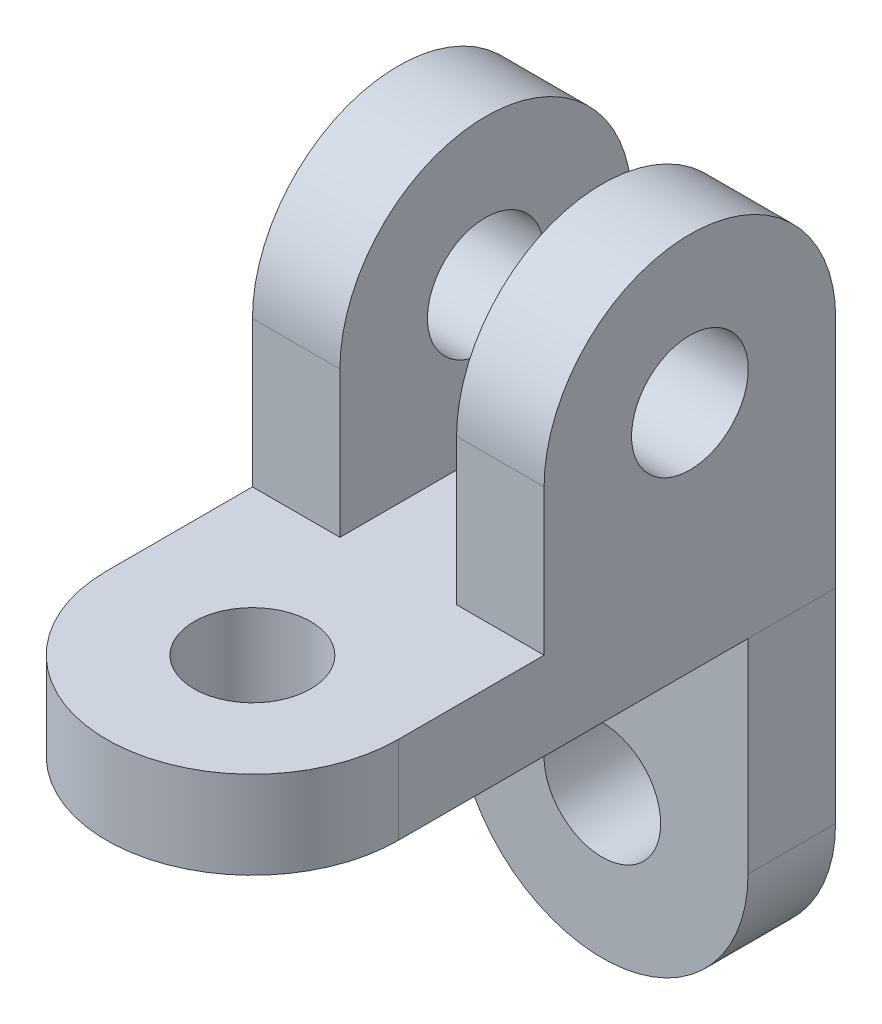
ISO-10303-21;
HEADER;
FILE_DESCRIPTION(('STEP AP214'),'2;1');
FILE_NAME('part.step','',(''),(''),'','','');
FILE_SCHEMA(('AUTOMOTIVE_DESIGN { 1 0 10303 214 1 1 1 1 }'));
ENDSEC;
DATA;
#1=APPLICATION_CONTEXT('core data for automotive mechanical design processes');
#2=APPLICATION_PROTOCOL_DEFINITION('international standard','automotive_design',2000,#1);
#3=PRODUCT_CONTEXT('',#1,'mechanical');
#4=PRODUCT('Part','Part','',(#3));
#5=PRODUCT_RELATED_PRODUCT_CATEGORY('part','',(#4));
#6=PRODUCT_DEFINITION_FORMATION('','',#4);
#7=PRODUCT_DEFINITION_CONTEXT('part definition',#1,'design');
#8=PRODUCT_DEFINITION('design','',#6,#7);
#9=PRODUCT_DEFINITION_SHAPE('','',#8);
#10=(LENGTH_UNIT() NAMED_UNIT(*) SI_UNIT(.MILLI.,.METRE.));
#11=(NAMED_UNIT(*) PLANE_ANGLE_UNIT() SI_UNIT($,.RADIAN.));
#12=(NAMED_UNIT(*) SI_UNIT($,.STERADIAN.) SOLID_ANGLE_UNIT());
#13=UNCERTAINTY_MEASURE_WITH_UNIT(LENGTH_MEASURE(1.E-05),#10,'distance_accuracy_value','');
#14=(GEOMETRIC_REPRESENTATION_CONTEXT(3) GLOBAL_UNCERTAINTY_ASSIGNED_CONTEXT((#13)) GLOBAL_UNIT_ASSIGNED_CONTEXT((#10,
#11,#12)) REPRESENTATION_CONTEXT('',''));
#15=CARTESIAN_POINT('',(0.,0.,0.));
#16=DIRECTION('',(0.,0.,1.));
#17=DIRECTION('',(1.,0.,0.));
#18=AXIS2_PLACEMENT_3D('',#15,#16,#17);
#19=CARTESIAN_POINT('',(0.,0.,0.));
#20=DIRECTION('',(0.,1.,0.));
#21=DIRECTION('',(0.,0.,1.));
#22=AXIS2_PLACEMENT_3D('',#19,#20,#21);
#23=PLANE('',#22);
#24=CARTESIAN_POINT('',(0.,0.,60.));
#25=DIRECTION('',(0.,1.,0.));
#26=DIRECTION('',(0.,0.,1.));
#27=AXIS2_PLACEMENT_3D('',#24,#25,#26);
#28=CIRCLE('',#27,8.);
#29=CARTESIAN_POINT('',(0.,0.,68.));
#30=VERTEX_POINT('',#29);
#31=EDGE_CURVE('E258',#30,#30,#28,.T.);
#32=ORIENTED_EDGE('',*,*,#31,.T.);
#33=EDGE_LOOP('',(#32));
#34=FACE_BOUND('',#33,.T.);
#35=DIRECTION('',(-1.,0.,0.));
#36=VECTOR('',#35,1.);
#37=CARTESIAN_POINT('',(0.,0.,12.));
#38=LINE('',#37,#36);
#39=CARTESIAN_POINT('',(20.,0.,12.));
#40=VERTEX_POINT('',#39);
#41=CARTESIAN_POINT('',(-20.,0.,12.));
#42=VERTEX_POINT('',#41);
#43=EDGE_CURVE('E61',#40,#42,#38,.T.);
#44=ORIENTED_EDGE('',*,*,#43,.F.);
#45=DIRECTION('',(0.,0.,-1.));
#46=VECTOR('',#45,1.);
#47=CARTESIAN_POINT('',(20.,0.,0.));
#48=LINE('',#47,#46);
#49=CARTESIAN_POINT('',(20.,0.,60.));
#50=VERTEX_POINT('',#49);
#51=EDGE_CURVE('E276',#50,#40,#48,.T.);
#52=ORIENTED_EDGE('',*,*,#51,.F.);
#53=CARTESIAN_POINT('',(0.,0.,60.));
#54=DIRECTION('',(0.,1.,0.));
#55=DIRECTION('',(0.,0.,1.));
#56=AXIS2_PLACEMENT_3D('',#53,#54,#55);
#57=CIRCLE('',#56,20.);
#58=CARTESIAN_POINT('',(-20.,0.,60.));
#59=VERTEX_POINT('',#58);
#60=EDGE_CURVE('E252',#59,#50,#57,.T.);
#61=ORIENTED_EDGE('',*,*,#60,.F.);
#62=DIRECTION('',(0.,0.,1.));
#63=VECTOR('',#62,1.);
#64=CARTESIAN_POINT('',(-20.,0.,0.));
#65=LINE('',#64,#63);
#66=EDGE_CURVE('E279',#42,#59,#65,.T.);
#67=ORIENTED_EDGE('',*,*,#66,.F.);
#68=EDGE_LOOP('',(#44,#52,#61,#67));
#69=FACE_BOUND('',#68,.T.);
#70=ADVANCED_FACE('F45',(#34,#69),#23,.F.);
#71=CARTESIAN_POINT('',(0.,12.,60.));
#72=DIRECTION('',(0.,-1.,0.));
#73=DIRECTION('',(0.,0.,-1.));
#74=AXIS2_PLACEMENT_3D('',#71,#72,#73);
#75=CYLINDRICAL_SURFACE('',#74,20.);
#76=ORIENTED_EDGE('',*,*,#60,.T.);
#77=DIRECTION('',(0.,-1.,0.));
#78=VECTOR('',#77,1.);
#79=CARTESIAN_POINT('',(20.,12.,60.));
#80=LINE('',#79,#78);
#81=CARTESIAN_POINT('',(20.,12.,60.));
#82=VERTEX_POINT('',#81);
#83=EDGE_CURVE('E11',#82,#50,#80,.T.);
#84=ORIENTED_EDGE('',*,*,#83,.F.);
#85=CARTESIAN_POINT('',(0.,12.,60.));
#86=DIRECTION('',(0.,1.,0.));
#87=DIRECTION('',(0.,0.,1.));
#88=AXIS2_PLACEMENT_3D('',#85,#86,#87);
#89=CIRCLE('',#88,20.);
#90=CARTESIAN_POINT('',(-20.,12.,60.));
#91=VERTEX_POINT('',#90);
#92=EDGE_CURVE('E253',#91,#82,#89,.T.);
#93=ORIENTED_EDGE('',*,*,#92,.F.);
#94=DIRECTION('',(0.,-1.,0.));
#95=VECTOR('',#94,1.);
#96=CARTESIAN_POINT('',(-20.,12.,60.));
#97=LINE('',#96,#95);
#98=EDGE_CURVE('E272',#91,#59,#97,.T.);
#99=ORIENTED_EDGE('',*,*,#98,.T.);
#100=EDGE_LOOP('',(#76,#84,#93,#99));
#101=FACE_BOUND('',#100,.T.);
#102=ADVANCED_FACE('F47',(#101),#75,.T.);
#103=CARTESIAN_POINT('',(20.,12.,0.));
#104=DIRECTION('',(-1.,0.,0.));
#105=DIRECTION('',(0.,0.,1.));
#106=AXIS2_PLACEMENT_3D('',#103,#104,#105);
#107=PLANE('',#106);
#108=ORIENTED_EDGE('',*,*,#51,.T.);
#109=DIRECTION('',(0.,0.,-1.));
#110=VECTOR('',#109,1.);
#111=CARTESIAN_POINT('',(20.,0.,12.));
#112=LINE('',#111,#110);
#113=CARTESIAN_POINT('',(20.,0.,0.));
#114=VERTEX_POINT('',#113);
#115=EDGE_CURVE('E146',#40,#114,#112,.T.);
#116=ORIENTED_EDGE('',*,*,#115,.T.);
#117=DIRECTION('',(0.,-1.,0.));
#118=VECTOR('',#117,1.);
#119=CARTESIAN_POINT('',(20.,12.,0.));
#120=LINE('',#119,#118);
#121=CARTESIAN_POINT('',(20.,32.,0.));
#122=VERTEX_POINT('',#121);
#123=EDGE_CURVE('E54',#122,#114,#120,.T.);
#124=ORIENTED_EDGE('',*,*,#123,.F.);
#125=CARTESIAN_POINT('',(20.,32.,20.));
#126=DIRECTION('',(1.,0.,0.));
#127=DIRECTION('',(0.,0.,-1.));
#128=AXIS2_PLACEMENT_3D('',#125,#126,#127);
#129=CIRCLE('',#128,20.);
#130=CARTESIAN_POINT('',(20.,32.,40.));
#131=VERTEX_POINT('',#130);
#132=EDGE_CURVE('E212',#122,#131,#129,.T.);
#133=ORIENTED_EDGE('',*,*,#132,.T.);
#134=DIRECTION('',(0.,-1.,0.));
#135=VECTOR('',#134,1.);
#136=CARTESIAN_POINT('',(20.,0.,40.));
#137=LINE('',#136,#135);
#138=CARTESIAN_POINT('',(20.,12.,40.));
#139=VERTEX_POINT('',#138);
#140=EDGE_CURVE('E216',#131,#139,#137,.T.);
#141=ORIENTED_EDGE('',*,*,#140,.T.);
#142=DIRECTION('',(0.,0.,-1.));
#143=VECTOR('',#142,1.);
#144=CARTESIAN_POINT('',(20.,12.,0.));
#145=LINE('',#144,#143);
#146=EDGE_CURVE('E257',#82,#139,#145,.T.);
#147=ORIENTED_EDGE('',*,*,#146,.F.);
#148=ORIENTED_EDGE('',*,*,#83,.T.);
#149=EDGE_LOOP('',(#108,#116,#124,#133,#141,#147,#148));
#150=FACE_BOUND('',#149,.T.);
#151=CARTESIAN_POINT('',(20.,32.,20.));
#152=DIRECTION('',(1.,0.,0.));
#153=DIRECTION('',(0.,0.,-1.));
#154=AXIS2_PLACEMENT_3D('',#151,#152,#153);
#155=CIRCLE('',#154,8.);
#156=CARTESIAN_POINT('',(20.,32.,12.));
#157=VERTEX_POINT('',#156);
#158=EDGE_CURVE('E220',#157,#157,#155,.T.);
#159=ORIENTED_EDGE('',*,*,#158,.F.);
#160=EDGE_LOOP('',(#159));
#161=FACE_BOUND('',#160,.T.);
#162=ADVANCED_FACE('F345',(#150,#161),#107,.F.);
#163=CARTESIAN_POINT('',(0.,12.,0.));
#164=DIRECTION('',(0.,0.,1.));
#165=DIRECTION('',(1.,0.,0.));
#166=AXIS2_PLACEMENT_3D('',#163,#164,#165);
#167=PLANE('',#166);
#168=ORIENTED_EDGE('',*,*,#123,.T.);
#169=DIRECTION('',(0.000995136954252468,0.999999504851099,0.));
#170=VECTOR('',#169,1.);
#171=CARTESIAN_POINT('',(19.9999801940488,-0.01990272923023,0.));
#172=LINE('',#171,#170);
#173=CARTESIAN_POINT('',(19.9721361514842,-28.,0.));
#174=VERTEX_POINT('',#173);
#175=EDGE_CURVE('E296',#174,#114,#172,.T.);
#176=ORIENTED_EDGE('',*,*,#175,.F.);
#177=CARTESIAN_POINT('',(-0.0139319242578925,-28.,0.));
#178=DIRECTION('',(0.,0.,1.));
#179=DIRECTION('',(1.,0.,0.));
#180=AXIS2_PLACEMENT_3D('',#177,#178,#179);
#181=CIRCLE('',#180,19.9860680757421);
#182=CARTESIAN_POINT('',(-20.,-28.,0.));
#183=VERTEX_POINT('',#182);
#184=EDGE_CURVE('E164',#183,#174,#181,.T.);
#185=ORIENTED_EDGE('',*,*,#184,.F.);
#186=DIRECTION('',(0.,-1.,0.));
#187=VECTOR('',#186,1.);
#188=CARTESIAN_POINT('',(-20.,12.,0.));
#189=LINE('',#188,#187);
#190=CARTESIAN_POINT('',(-20.,32.,0.));
#191=VERTEX_POINT('',#190);
#192=EDGE_CURVE('E288',#191,#183,#189,.T.);
#193=ORIENTED_EDGE('',*,*,#192,.F.);
#194=DIRECTION('',(1.,0.,0.));
#195=VECTOR('',#194,1.);
#196=CARTESIAN_POINT('',(-20.,32.,0.));
#197=LINE('',#196,#195);
#198=CARTESIAN_POINT('',(-8.,32.,0.));
#199=VERTEX_POINT('',#198);
#200=EDGE_CURVE('E188',#191,#199,#197,.T.);
#201=ORIENTED_EDGE('',*,*,#200,.T.);
#202=DIRECTION('',(0.,1.,0.));
#203=VECTOR('',#202,1.);
#204=CARTESIAN_POINT('',(-8.,0.,0.));
#205=LINE('',#204,#203);
#206=CARTESIAN_POINT('',(-8.,12.,0.));
#207=VERTEX_POINT('',#206);
#208=EDGE_CURVE('E171',#207,#199,#205,.T.);
#209=ORIENTED_EDGE('',*,*,#208,.F.);
#210=DIRECTION('',(-1.,0.,0.));
#211=VECTOR('',#210,1.);
#212=CARTESIAN_POINT('',(0.,12.,0.));
#213=LINE('',#212,#211);
#214=CARTESIAN_POINT('',(8.,12.,0.));
#215=VERTEX_POINT('',#214);
#216=EDGE_CURVE('E262',#215,#207,#213,.T.);
#217=ORIENTED_EDGE('',*,*,#216,.F.);
#218=DIRECTION('',(0.,1.,0.));
#219=VECTOR('',#218,1.);
#220=CARTESIAN_POINT('',(8.,0.,0.));
#221=LINE('',#220,#219);
#222=CARTESIAN_POINT('',(8.,32.,0.));
#223=VERTEX_POINT('',#222);
#224=EDGE_CURVE('E235',#215,#223,#221,.T.);
#225=ORIENTED_EDGE('',*,*,#224,.T.);
#226=DIRECTION('',(-1.,0.,0.));
#227=VECTOR('',#226,1.);
#228=CARTESIAN_POINT('',(20.,32.,0.));
#229=LINE('',#228,#227);
#230=EDGE_CURVE('E224',#122,#223,#229,.T.);
#231=ORIENTED_EDGE('',*,*,#230,.F.);
#232=EDGE_LOOP('',(#168,#176,#185,#193,#201,#209,#217,#225,#231));
#233=FACE_BOUND('',#232,.T.);
#234=CARTESIAN_POINT('',(-0.0139319242578925,-28.,0.));
#235=DIRECTION('',(0.,0.,1.));
#236=DIRECTION('',(1.,0.,0.));
#237=AXIS2_PLACEMENT_3D('',#234,#235,#236);
#238=CIRCLE('',#237,8.);
#239=CARTESIAN_POINT('',(7.98606807574211,-28.,0.));
#240=VERTEX_POINT('',#239);
#241=EDGE_CURVE('E160',#240,#240,#238,.T.);
#242=ORIENTED_EDGE('',*,*,#241,.T.);
#243=EDGE_LOOP('',(#242));
#244=FACE_BOUND('',#243,.T.);
#245=ADVANCED_FACE('F294',(#233,#244),#167,.F.);
#246=CARTESIAN_POINT('',(-20.,12.,0.));
#247=DIRECTION('',(1.,0.,0.));
#248=DIRECTION('',(0.,0.,-1.));
#249=AXIS2_PLACEMENT_3D('',#246,#247,#248);
#250=PLANE('',#249);
#251=ORIENTED_EDGE('',*,*,#192,.T.);
#252=DIRECTION('',(0.,0.,-1.));
#253=VECTOR('',#252,1.);
#254=CARTESIAN_POINT('',(-20.,-28.,12.));
#255=LINE('',#254,#253);
#256=CARTESIAN_POINT('',(-20.,-28.,12.));
#257=VERTEX_POINT('',#256);
#258=EDGE_CURVE('E173',#257,#183,#255,.T.);
#259=ORIENTED_EDGE('',*,*,#258,.F.);
#260=DIRECTION('',(0.,-1.,0.));
#261=VECTOR('',#260,1.);
#262=CARTESIAN_POINT('',(-20.,0.,12.));
#263=LINE('',#262,#261);
#264=EDGE_CURVE('E155',#42,#257,#263,.T.);
#265=ORIENTED_EDGE('',*,*,#264,.F.);
#266=ORIENTED_EDGE('',*,*,#66,.T.);
#267=ORIENTED_EDGE('',*,*,#98,.F.);
#268=DIRECTION('',(0.,0.,1.));
#269=VECTOR('',#268,1.);
#270=CARTESIAN_POINT('',(-20.,12.,0.));
#271=LINE('',#270,#269);
#272=CARTESIAN_POINT('',(-20.,12.,40.));
#273=VERTEX_POINT('',#272);
#274=EDGE_CURVE('E265',#273,#91,#271,.T.);
#275=ORIENTED_EDGE('',*,*,#274,.F.);
#276=DIRECTION('',(0.,-1.,0.));
#277=VECTOR('',#276,1.);
#278=CARTESIAN_POINT('',(-20.,0.,40.));
#279=LINE('',#278,#277);
#280=CARTESIAN_POINT('',(-20.,32.,40.));
#281=VERTEX_POINT('',#280);
#282=EDGE_CURVE('E185',#281,#273,#279,.T.);
#283=ORIENTED_EDGE('',*,*,#282,.F.);
#284=CARTESIAN_POINT('',(-20.,32.,20.));
#285=DIRECTION('',(1.,0.,0.));
#286=DIRECTION('',(0.,0.,-1.));
#287=AXIS2_PLACEMENT_3D('',#284,#285,#286);
#288=CIRCLE('',#287,20.);
#289=EDGE_CURVE('E181',#191,#281,#288,.T.);
#290=ORIENTED_EDGE('',*,*,#289,.F.);
#291=EDGE_LOOP('',(#251,#259,#265,#266,#267,#275,#283,#290));
#292=FACE_BOUND('',#291,.T.);
#293=CARTESIAN_POINT('',(-20.,32.,20.));
#294=DIRECTION('',(1.,0.,0.));
#295=DIRECTION('',(0.,0.,-1.));
#296=AXIS2_PLACEMENT_3D('',#293,#294,#295);
#297=CIRCLE('',#296,8.);
#298=CARTESIAN_POINT('',(-20.,32.,12.));
#299=VERTEX_POINT('',#298);
#300=EDGE_CURVE('E177',#299,#299,#297,.T.);
#301=ORIENTED_EDGE('',*,*,#300,.T.);
#302=EDGE_LOOP('',(#301));
#303=FACE_BOUND('',#302,.T.);
#304=ADVANCED_FACE('F318',(#292,#303),#250,.F.);
#305=CARTESIAN_POINT('',(0.,12.,60.));
#306=DIRECTION('',(0.,-1.,0.));
#307=DIRECTION('',(0.,0.,-1.));
#308=AXIS2_PLACEMENT_3D('',#305,#306,#307);
#309=CYLINDRICAL_SURFACE('',#308,8.);
#310=CARTESIAN_POINT('',(0.,12.,60.));
#311=DIRECTION('',(0.,1.,0.));
#312=DIRECTION('',(0.,0.,1.));
#313=AXIS2_PLACEMENT_3D('',#310,#311,#312);
#314=CIRCLE('',#313,8.);
#315=CARTESIAN_POINT('',(0.,12.,68.));
#316=VERTEX_POINT('',#315);
#317=EDGE_CURVE('E268',#316,#316,#314,.T.);
#318=ORIENTED_EDGE('',*,*,#317,.T.);
#319=EDGE_LOOP('',(#318));
#320=FACE_BOUND('',#319,.T.);
#321=ORIENTED_EDGE('',*,*,#31,.F.);
#322=EDGE_LOOP('',(#321));
#323=FACE_BOUND('',#322,.T.);
#324=ADVANCED_FACE('F361',(#320,#323),#309,.F.);
#325=CARTESIAN_POINT('',(0.,12.,0.));
#326=DIRECTION('',(0.,1.,0.));
#327=DIRECTION('',(0.,0.,1.));
#328=AXIS2_PLACEMENT_3D('',#325,#326,#327);
#329=PLANE('',#328);
#330=DIRECTION('',(1.,0.,0.));
#331=VECTOR('',#330,1.);
#332=CARTESIAN_POINT('',(-20.,12.,40.));
#333=LINE('',#332,#331);
#334=CARTESIAN_POINT('',(-8.,12.,40.));
#335=VERTEX_POINT('',#334);
#336=EDGE_CURVE('E203',#273,#335,#333,.T.);
#337=ORIENTED_EDGE('',*,*,#336,.F.);
#338=ORIENTED_EDGE('',*,*,#274,.T.);
#339=ORIENTED_EDGE('',*,*,#92,.T.);
#340=ORIENTED_EDGE('',*,*,#146,.T.);
#341=DIRECTION('',(-1.,0.,0.));
#342=VECTOR('',#341,1.);
#343=CARTESIAN_POINT('',(20.,12.,40.));
#344=LINE('',#343,#342);
#345=CARTESIAN_POINT('',(8.,12.,40.));
#346=VERTEX_POINT('',#345);
#347=EDGE_CURVE('E244',#139,#346,#344,.T.);
#348=ORIENTED_EDGE('',*,*,#347,.T.);
#349=DIRECTION('',(0.,0.,1.));
#350=VECTOR('',#349,1.);
#351=CARTESIAN_POINT('',(8.,12.,0.));
#352=LINE('',#351,#350);
#353=EDGE_CURVE('E232',#215,#346,#352,.T.);
#354=ORIENTED_EDGE('',*,*,#353,.F.);
#355=ORIENTED_EDGE('',*,*,#216,.T.);
#356=DIRECTION('',(0.,0.,1.));
#357=VECTOR('',#356,1.);
#358=CARTESIAN_POINT('',(-8.,12.,0.));
#359=LINE('',#358,#357);
#360=EDGE_CURVE('E69',#207,#335,#359,.T.);
#361=ORIENTED_EDGE('',*,*,#360,.T.);
#362=EDGE_LOOP('',(#337,#338,#339,#340,#348,#354,#355,#361));
#363=FACE_BOUND('',#362,.T.);
#364=ORIENTED_EDGE('',*,*,#317,.F.);
#365=EDGE_LOOP('',(#364));
#366=FACE_BOUND('',#365,.T.);
#367=ADVANCED_FACE('F333',(#363,#366),#329,.T.);
#368=CARTESIAN_POINT('',(20.,32.,20.));
#369=DIRECTION('',(-1.,0.,0.));
#370=DIRECTION('',(0.,0.,1.));
#371=AXIS2_PLACEMENT_3D('',#368,#369,#370);
#372=CYLINDRICAL_SURFACE('',#371,20.);
#373=CARTESIAN_POINT('',(8.,32.,20.));
#374=DIRECTION('',(1.,0.,0.));
#375=DIRECTION('',(0.,0.,-1.));
#376=AXIS2_PLACEMENT_3D('',#373,#374,#375);
#377=CIRCLE('',#376,20.);
#378=CARTESIAN_POINT('',(8.,32.,40.));
#379=VERTEX_POINT('',#378);
#380=EDGE_CURVE('E206',#223,#379,#377,.T.);
#381=ORIENTED_EDGE('',*,*,#380,.T.);
#382=DIRECTION('',(-1.,0.,0.));
#383=VECTOR('',#382,1.);
#384=CARTESIAN_POINT('',(20.,32.,40.));
#385=LINE('',#384,#383);
#386=EDGE_CURVE('E248',#131,#379,#385,.T.);
#387=ORIENTED_EDGE('',*,*,#386,.F.);
#388=ORIENTED_EDGE('',*,*,#132,.F.);
#389=ORIENTED_EDGE('',*,*,#230,.T.);
#390=EDGE_LOOP('',(#381,#387,#388,#389));
#391=FACE_BOUND('',#390,.T.);
#392=ADVANCED_FACE('F344',(#391),#372,.T.);
#393=CARTESIAN_POINT('',(20.,0.,40.));
#394=DIRECTION('',(0.,0.,-1.));
#395=DIRECTION('',(-1.,0.,0.));
#396=AXIS2_PLACEMENT_3D('',#393,#394,#395);
#397=PLANE('',#396);
#398=DIRECTION('',(0.,-1.,0.));
#399=VECTOR('',#398,1.);
#400=CARTESIAN_POINT('',(8.,0.,40.));
#401=LINE('',#400,#399);
#402=EDGE_CURVE('E228',#379,#346,#401,.T.);
#403=ORIENTED_EDGE('',*,*,#402,.T.);
#404=ORIENTED_EDGE('',*,*,#347,.F.);
#405=ORIENTED_EDGE('',*,*,#140,.F.);
#406=ORIENTED_EDGE('',*,*,#386,.T.);
#407=EDGE_LOOP('',(#403,#404,#405,#406));
#408=FACE_BOUND('',#407,.T.);
#409=ADVANCED_FACE('F341',(#408),#397,.F.);
#410=CARTESIAN_POINT('',(20.,32.,20.));
#411=DIRECTION('',(-1.,0.,0.));
#412=DIRECTION('',(0.,0.,1.));
#413=AXIS2_PLACEMENT_3D('',#410,#411,#412);
#414=CYLINDRICAL_SURFACE('',#413,8.);
#415=ORIENTED_EDGE('',*,*,#158,.T.);
#416=EDGE_LOOP('',(#415));
#417=FACE_BOUND('',#416,.T.);
#418=CARTESIAN_POINT('',(8.,32.,20.));
#419=DIRECTION('',(1.,0.,0.));
#420=DIRECTION('',(0.,0.,-1.));
#421=AXIS2_PLACEMENT_3D('',#418,#419,#420);
#422=CIRCLE('',#421,8.);
#423=CARTESIAN_POINT('',(8.,32.,12.));
#424=VERTEX_POINT('',#423);
#425=EDGE_CURVE('E217',#424,#424,#422,.T.);
#426=ORIENTED_EDGE('',*,*,#425,.F.);
#427=EDGE_LOOP('',(#426));
#428=FACE_BOUND('',#427,.T.);
#429=ADVANCED_FACE('F404',(#417,#428),#414,.F.);
#430=CARTESIAN_POINT('',(8.,0.,0.));
#431=DIRECTION('',(1.,0.,0.));
#432=DIRECTION('',(0.,0.,-1.));
#433=AXIS2_PLACEMENT_3D('',#430,#431,#432);
#434=PLANE('',#433);
#435=ORIENTED_EDGE('',*,*,#380,.F.);
#436=ORIENTED_EDGE('',*,*,#224,.F.);
#437=ORIENTED_EDGE('',*,*,#353,.T.);
#438=ORIENTED_EDGE('',*,*,#402,.F.);
#439=EDGE_LOOP('',(#435,#436,#437,#438));
#440=FACE_BOUND('',#439,.T.);
#441=ORIENTED_EDGE('',*,*,#425,.T.);
#442=EDGE_LOOP('',(#441));
#443=FACE_BOUND('',#442,.T.);
#444=ADVANCED_FACE('F338',(#440,#443),#434,.F.);
#445=CARTESIAN_POINT('',(-20.,0.,40.));
#446=DIRECTION('',(0.,0.,1.));
#447=DIRECTION('',(1.,0.,0.));
#448=AXIS2_PLACEMENT_3D('',#445,#446,#447);
#449=PLANE('',#448);
#450=DIRECTION('',(0.,-1.,0.));
#451=VECTOR('',#450,1.);
#452=CARTESIAN_POINT('',(-8.,0.,40.));
#453=LINE('',#452,#451);
#454=CARTESIAN_POINT('',(-8.,32.,40.));
#455=VERTEX_POINT('',#454);
#456=EDGE_CURVE('E197',#455,#335,#453,.T.);
#457=ORIENTED_EDGE('',*,*,#456,.F.);
#458=DIRECTION('',(1.,0.,0.));
#459=VECTOR('',#458,1.);
#460=CARTESIAN_POINT('',(-20.,32.,40.));
#461=LINE('',#460,#459);
#462=EDGE_CURVE('E207',#281,#455,#461,.T.);
#463=ORIENTED_EDGE('',*,*,#462,.F.);
#464=ORIENTED_EDGE('',*,*,#282,.T.);
#465=ORIENTED_EDGE('',*,*,#336,.T.);
#466=EDGE_LOOP('',(#457,#463,#464,#465));
#467=FACE_BOUND('',#466,.T.);
#468=ADVANCED_FACE('F417',(#467),#449,.T.);
#469=CARTESIAN_POINT('',(-20.,32.,20.));
#470=DIRECTION('',(1.,0.,0.));
#471=DIRECTION('',(0.,0.,-1.));
#472=AXIS2_PLACEMENT_3D('',#469,#470,#471);
#473=CYLINDRICAL_SURFACE('',#472,8.);
#474=ORIENTED_EDGE('',*,*,#300,.F.);
#475=EDGE_LOOP('',(#474));
#476=FACE_BOUND('',#475,.T.);
#477=CARTESIAN_POINT('',(-8.,32.,20.));
#478=DIRECTION('',(1.,0.,0.));
#479=DIRECTION('',(0.,0.,-1.));
#480=AXIS2_PLACEMENT_3D('',#477,#478,#479);
#481=CIRCLE('',#480,8.);
#482=CARTESIAN_POINT('',(-8.,32.,12.));
#483=VERTEX_POINT('',#482);
#484=EDGE_CURVE('E166',#483,#483,#481,.T.);
#485=ORIENTED_EDGE('',*,*,#484,.T.);
#486=EDGE_LOOP('',(#485));
#487=FACE_BOUND('',#486,.T.);
#488=ADVANCED_FACE('F423',(#476,#487),#473,.F.);
#489=CARTESIAN_POINT('',(-20.,32.,20.));
#490=DIRECTION('',(1.,0.,0.));
#491=DIRECTION('',(0.,0.,-1.));
#492=AXIS2_PLACEMENT_3D('',#489,#490,#491);
#493=CYLINDRICAL_SURFACE('',#492,20.);
#494=CARTESIAN_POINT('',(-8.,32.,20.));
#495=DIRECTION('',(1.,0.,0.));
#496=DIRECTION('',(0.,0.,-1.));
#497=AXIS2_PLACEMENT_3D('',#494,#495,#496);
#498=CIRCLE('',#497,20.);
#499=EDGE_CURVE('E193',#199,#455,#498,.T.);
#500=ORIENTED_EDGE('',*,*,#499,.F.);
#501=ORIENTED_EDGE('',*,*,#200,.F.);
#502=ORIENTED_EDGE('',*,*,#289,.T.);
#503=ORIENTED_EDGE('',*,*,#462,.T.);
#504=EDGE_LOOP('',(#500,#501,#502,#503));
#505=FACE_BOUND('',#504,.T.);
#506=ADVANCED_FACE('F327',(#505),#493,.T.);
#507=CARTESIAN_POINT('',(-8.,0.,0.));
#508=DIRECTION('',(1.,0.,0.));
#509=DIRECTION('',(0.,0.,-1.));
#510=AXIS2_PLACEMENT_3D('',#507,#508,#509);
#511=PLANE('',#510);
#512=ORIENTED_EDGE('',*,*,#484,.F.);
#513=EDGE_LOOP('',(#512));
#514=FACE_BOUND('',#513,.T.);
#515=ORIENTED_EDGE('',*,*,#208,.T.);
#516=ORIENTED_EDGE('',*,*,#499,.T.);
#517=ORIENTED_EDGE('',*,*,#456,.T.);
#518=ORIENTED_EDGE('',*,*,#360,.F.);
#519=EDGE_LOOP('',(#515,#516,#517,#518));
#520=FACE_BOUND('',#519,.T.);
#521=ADVANCED_FACE('F330',(#514,#520),#511,.T.);
#522=CARTESIAN_POINT('',(-0.0139319242578925,-28.,12.));
#523=DIRECTION('',(0.,0.,-1.));
#524=DIRECTION('',(-1.,0.,0.));
#525=AXIS2_PLACEMENT_3D('',#522,#523,#524);
#526=CYLINDRICAL_SURFACE('',#525,19.9860680757421);
#527=ORIENTED_EDGE('',*,*,#184,.T.);
#528=DIRECTION('',(0.,0.,-1.));
#529=VECTOR('',#528,1.);
#530=CARTESIAN_POINT('',(19.9721361514842,-28.,12.));
#531=LINE('',#530,#529);
#532=CARTESIAN_POINT('',(19.9721361514842,-28.,12.));
#533=VERTEX_POINT('',#532);
#534=EDGE_CURVE('E144',#533,#174,#531,.T.);
#535=ORIENTED_EDGE('',*,*,#534,.F.);
#536=CARTESIAN_POINT('',(-0.0139319242578925,-28.,12.));
#537=DIRECTION('',(0.,0.,1.));
#538=DIRECTION('',(1.,0.,0.));
#539=AXIS2_PLACEMENT_3D('',#536,#537,#538);
#540=CIRCLE('',#539,19.9860680757421);
#541=EDGE_CURVE('E149',#257,#533,#540,.T.);
#542=ORIENTED_EDGE('',*,*,#541,.F.);
#543=ORIENTED_EDGE('',*,*,#258,.T.);
#544=EDGE_LOOP('',(#527,#535,#542,#543));
#545=FACE_BOUND('',#544,.T.);
#546=ADVANCED_FACE('F162',(#545),#526,.T.);
#547=CARTESIAN_POINT('',(19.9999801940488,-0.01990272923023,12.));
#548=DIRECTION('',(-0.999999504851098,0.000995136954252468,0.));
#549=DIRECTION('',(-0.000995136954252468,-0.999999504851099,0.));
#550=AXIS2_PLACEMENT_3D('',#547,#548,#549);
#551=PLANE('',#550);
#552=ORIENTED_EDGE('',*,*,#175,.T.);
#553=ORIENTED_EDGE('',*,*,#115,.F.);
#554=DIRECTION('',(0.000995136954252468,0.999999504851099,0.));
#555=VECTOR('',#554,1.);
#556=CARTESIAN_POINT('',(19.9999801940488,-0.01990272923023,12.));
#557=LINE('',#556,#555);
#558=EDGE_CURVE('E139',#533,#40,#557,.T.);
#559=ORIENTED_EDGE('',*,*,#558,.F.);
#560=ORIENTED_EDGE('',*,*,#534,.T.);
#561=EDGE_LOOP('',(#552,#553,#559,#560));
#562=FACE_BOUND('',#561,.T.);
#563=ADVANCED_FACE('F142',(#562),#551,.F.);
#564=CARTESIAN_POINT('',(-0.0139319242578925,-28.,12.));
#565=DIRECTION('',(0.,0.,-1.));
#566=DIRECTION('',(-1.,0.,0.));
#567=AXIS2_PLACEMENT_3D('',#564,#565,#566);
#568=CYLINDRICAL_SURFACE('',#567,8.);
#569=CARTESIAN_POINT('',(-0.0139319242578925,-28.,12.));
#570=DIRECTION('',(0.,0.,1.));
#571=DIRECTION('',(1.,0.,0.));
#572=AXIS2_PLACEMENT_3D('',#569,#570,#571);
#573=CIRCLE('',#572,8.);
#574=CARTESIAN_POINT('',(7.98606807574211,-28.,12.));
#575=VERTEX_POINT('',#574);
#576=EDGE_CURVE('E308',#575,#575,#573,.T.);
#577=ORIENTED_EDGE('',*,*,#576,.T.);
#578=EDGE_LOOP('',(#577));
#579=FACE_BOUND('',#578,.T.);
#580=ORIENTED_EDGE('',*,*,#241,.F.);
#581=EDGE_LOOP('',(#580));
#582=FACE_BOUND('',#581,.T.);
#583=ADVANCED_FACE('F456',(#579,#582),#568,.F.);
#584=CARTESIAN_POINT('',(0.,0.,12.));
#585=DIRECTION('',(0.,0.,1.));
#586=DIRECTION('',(1.,0.,0.));
#587=AXIS2_PLACEMENT_3D('',#584,#585,#586);
#588=PLANE('',#587);
#589=ORIENTED_EDGE('',*,*,#541,.T.);
#590=ORIENTED_EDGE('',*,*,#558,.T.);
#591=ORIENTED_EDGE('',*,*,#43,.T.);
#592=ORIENTED_EDGE('',*,*,#264,.T.);
#593=EDGE_LOOP('',(#589,#590,#591,#592));
#594=FACE_BOUND('',#593,.T.);
#595=ORIENTED_EDGE('',*,*,#576,.F.);
#596=EDGE_LOOP('',(#595));
#597=FACE_BOUND('',#596,.T.);
#598=ADVANCED_FACE('F152',(#594,#597),#588,.T.);
#599=CLOSED_SHELL('',(#70,#102,#162,#245,#304,#324,#367,#392,#409,#429,#444,#468,#488,#506,#521,
#546,#563,#583,#598));
#600=MANIFOLD_SOLID_BREP('B2',#599);
#601=ADVANCED_BREP_SHAPE_REPRESENTATION('',(#18,#600),#14);
#602=SHAPE_DEFINITION_REPRESENTATION(#9,#601);
ENDSEC;
END-ISO-10303-21;
